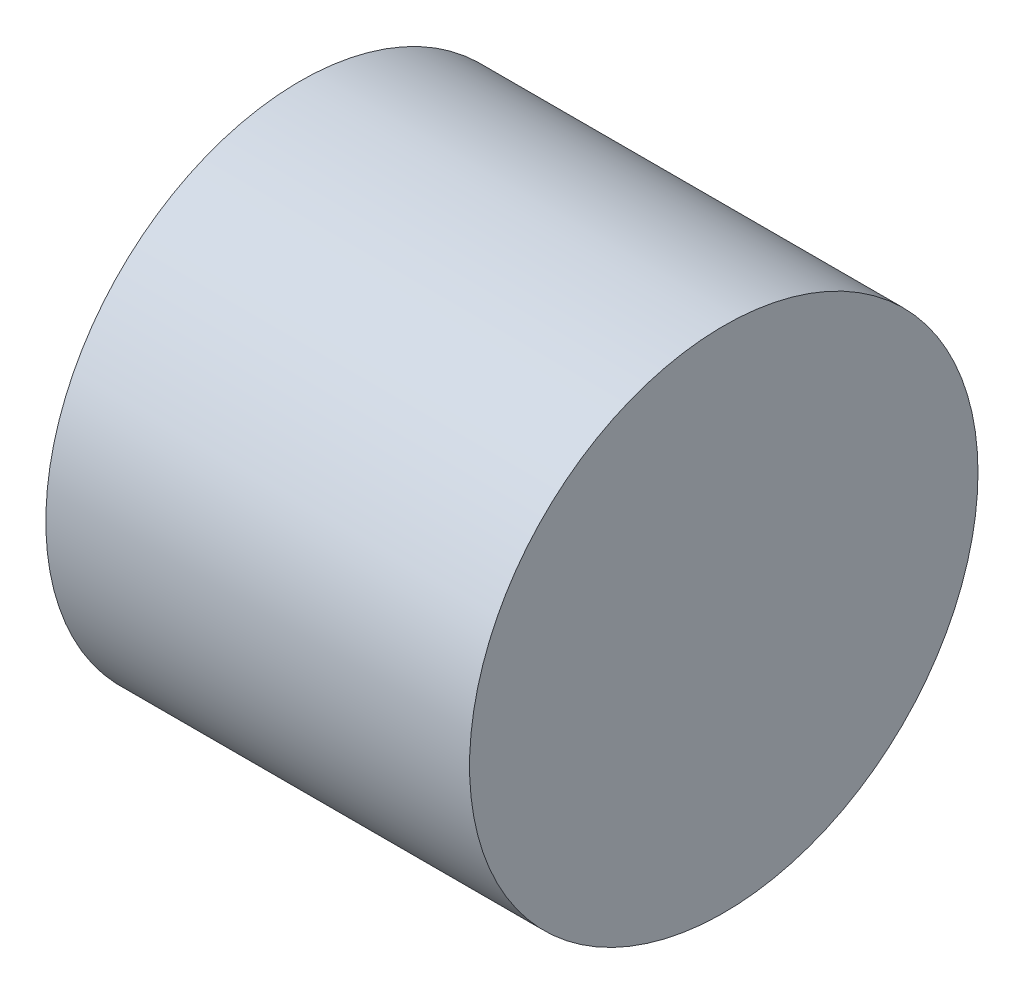
ISO-10303-21;
HEADER;
FILE_DESCRIPTION(('STEP AP214'),'2;1');
FILE_NAME('part.step','',(''),(''),'','','');
FILE_SCHEMA(('AUTOMOTIVE_DESIGN { 1 0 10303 214 1 1 1 1 }'));
ENDSEC;
DATA;
#1=APPLICATION_CONTEXT('core data for automotive mechanical design processes');
#2=APPLICATION_PROTOCOL_DEFINITION('international standard','automotive_design',2000,#1);
#3=PRODUCT_CONTEXT('',#1,'mechanical');
#4=PRODUCT('Part','Part','',(#3));
#5=PRODUCT_RELATED_PRODUCT_CATEGORY('part','',(#4));
#6=PRODUCT_DEFINITION_FORMATION('','',#4);
#7=PRODUCT_DEFINITION_CONTEXT('part definition',#1,'design');
#8=PRODUCT_DEFINITION('design','',#6,#7);
#9=PRODUCT_DEFINITION_SHAPE('','',#8);
#10=(LENGTH_UNIT() NAMED_UNIT(*) SI_UNIT(.MILLI.,.METRE.));
#11=(NAMED_UNIT(*) PLANE_ANGLE_UNIT() SI_UNIT($,.RADIAN.));
#12=(NAMED_UNIT(*) SI_UNIT($,.STERADIAN.) SOLID_ANGLE_UNIT());
#13=UNCERTAINTY_MEASURE_WITH_UNIT(LENGTH_MEASURE(1.E-05),#10,'distance_accuracy_value','');
#14=(GEOMETRIC_REPRESENTATION_CONTEXT(3) GLOBAL_UNCERTAINTY_ASSIGNED_CONTEXT((#13)) GLOBAL_UNIT_ASSIGNED_CONTEXT((#10,
#11,#12)) REPRESENTATION_CONTEXT('',''));
#15=CARTESIAN_POINT('',(0.,0.,0.));
#16=DIRECTION('',(0.,0.,1.));
#17=DIRECTION('',(1.,0.,0.));
#18=AXIS2_PLACEMENT_3D('',#15,#16,#17);
#19=CARTESIAN_POINT('',(5.,0.,0.));
#20=DIRECTION('',(-1.,0.,0.));
#21=DIRECTION('',(0.,0.,1.));
#22=AXIS2_PLACEMENT_3D('',#19,#20,#21);
#23=CYLINDRICAL_SURFACE('',#22,3.);
#24=CARTESIAN_POINT('',(5.,0.,0.));
#25=DIRECTION('',(1.,0.,0.));
#26=DIRECTION('',(0.,0.,-1.));
#27=AXIS2_PLACEMENT_3D('',#24,#25,#26);
#28=CIRCLE('',#27,3.);
#29=CARTESIAN_POINT('',(5.,0.,-3.));
#30=VERTEX_POINT('',#29);
#31=EDGE_CURVE('E10',#30,#30,#28,.T.);
#32=ORIENTED_EDGE('',*,*,#31,.F.);
#33=EDGE_LOOP('',(#32));
#34=FACE_BOUND('',#33,.T.);
#35=CARTESIAN_POINT('',(0.,0.,0.));
#36=DIRECTION('',(1.,0.,0.));
#37=DIRECTION('',(0.,0.,-1.));
#38=AXIS2_PLACEMENT_3D('',#35,#36,#37);
#39=CIRCLE('',#38,3.);
#40=CARTESIAN_POINT('',(0.,0.,-3.));
#41=VERTEX_POINT('',#40);
#42=EDGE_CURVE('E33',#41,#41,#39,.T.);
#43=ORIENTED_EDGE('',*,*,#42,.T.);
#44=EDGE_LOOP('',(#43));
#45=FACE_BOUND('',#44,.T.);
#46=ADVANCED_FACE('F30',(#34,#45),#23,.T.);
#47=CARTESIAN_POINT('',(5.,0.,0.));
#48=DIRECTION('',(1.,0.,0.));
#49=DIRECTION('',(0.,0.,-1.));
#50=AXIS2_PLACEMENT_3D('',#47,#48,#49);
#51=PLANE('',#50);
#52=ORIENTED_EDGE('',*,*,#31,.T.);
#53=EDGE_LOOP('',(#52));
#54=FACE_BOUND('',#53,.T.);
#55=ADVANCED_FACE('F45',(#54),#51,.T.);
#56=CARTESIAN_POINT('',(0.,0.,0.));
#57=DIRECTION('',(1.,0.,0.));
#58=DIRECTION('',(0.,0.,-1.));
#59=AXIS2_PLACEMENT_3D('',#56,#57,#58);
#60=PLANE('',#59);
#61=ORIENTED_EDGE('',*,*,#42,.F.);
#62=EDGE_LOOP('',(#61));
#63=FACE_BOUND('',#62,.T.);
#64=ADVANCED_FACE('F43',(#63),#60,.F.);
#65=CLOSED_SHELL('',(#46,#55,#64));
#66=MANIFOLD_SOLID_BREP('B2',#65);
#67=ADVANCED_BREP_SHAPE_REPRESENTATION('',(#18,#66),#14);
#68=SHAPE_DEFINITION_REPRESENTATION(#9,#67);
ENDSEC;
END-ISO-10303-21;
